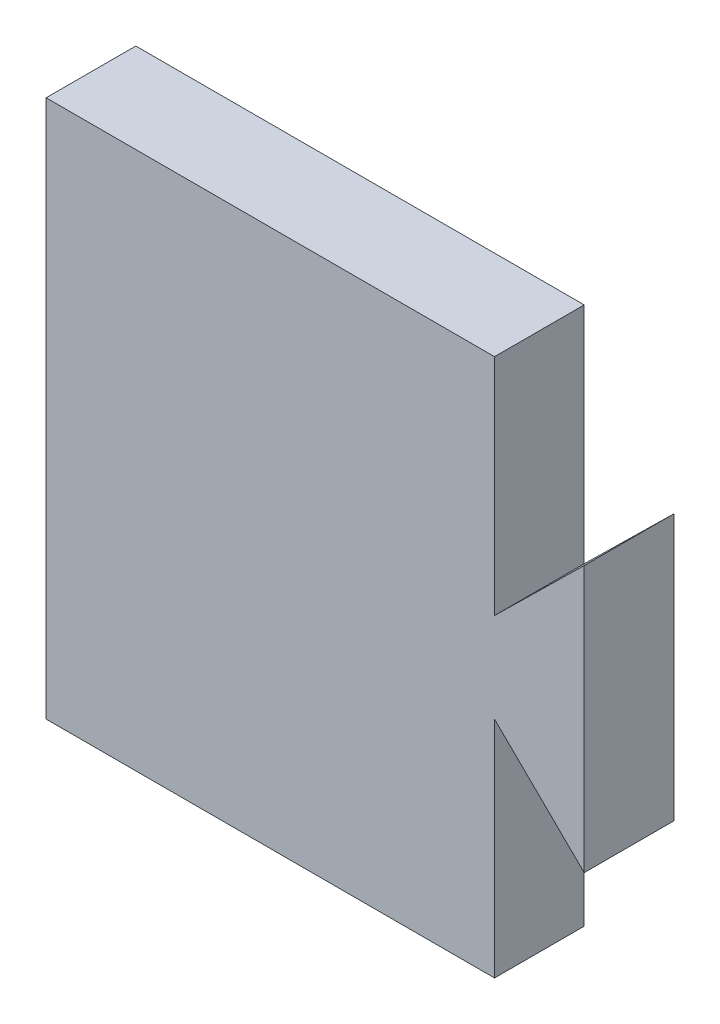
ISO-10303-21;
HEADER;
FILE_DESCRIPTION(('STEP AP214'),'2;1');
FILE_NAME('part.step','',(''),(''),'','','');
FILE_SCHEMA(('AUTOMOTIVE_DESIGN { 1 0 10303 214 1 1 1 1 }'));
ENDSEC;
DATA;
#1=APPLICATION_CONTEXT('core data for automotive mechanical design processes');
#2=APPLICATION_PROTOCOL_DEFINITION('international standard','automotive_design',2000,#1);
#3=PRODUCT_CONTEXT('',#1,'mechanical');
#4=PRODUCT('Part','Part','',(#3));
#5=PRODUCT_RELATED_PRODUCT_CATEGORY('part','',(#4));
#6=PRODUCT_DEFINITION_FORMATION('','',#4);
#7=PRODUCT_DEFINITION_CONTEXT('part definition',#1,'design');
#8=PRODUCT_DEFINITION('design','',#6,#7);
#9=PRODUCT_DEFINITION_SHAPE('','',#8);
#10=(LENGTH_UNIT() NAMED_UNIT(*) SI_UNIT(.MILLI.,.METRE.));
#11=(NAMED_UNIT(*) PLANE_ANGLE_UNIT() SI_UNIT($,.RADIAN.));
#12=(NAMED_UNIT(*) SI_UNIT($,.STERADIAN.) SOLID_ANGLE_UNIT());
#13=UNCERTAINTY_MEASURE_WITH_UNIT(LENGTH_MEASURE(1.E-05),#10,'distance_accuracy_value','');
#14=(GEOMETRIC_REPRESENTATION_CONTEXT(3) GLOBAL_UNCERTAINTY_ASSIGNED_CONTEXT((#13)) GLOBAL_UNIT_ASSIGNED_CONTEXT((#10,
#11,#12)) REPRESENTATION_CONTEXT('',''));
#15=CARTESIAN_POINT('',(0.,0.,0.));
#16=DIRECTION('',(0.,0.,1.));
#17=DIRECTION('',(1.,0.,0.));
#18=AXIS2_PLACEMENT_3D('',#15,#16,#17);
#19=CARTESIAN_POINT('',(7.21311475409836,15.983606557377,10.));
#20=DIRECTION('',(-1.,0.,0.));
#21=DIRECTION('',(0.,-1.,0.));
#22=AXIS2_PLACEMENT_3D('',#19,#20,#21);
#23=PLANE('',#22);
#24=DIRECTION('',(0.,0.,1.));
#25=VECTOR('',#24,1.);
#26=CARTESIAN_POINT('',(7.21311475409836,-9.01639344262295,0.));
#27=LINE('',#26,#25);
#28=CARTESIAN_POINT('',(7.21311475409836,-9.01639344262295,0.));
#29=VERTEX_POINT('',#28);
#30=CARTESIAN_POINT('',(7.21311475409836,-9.01639344262295,10.));
#31=VERTEX_POINT('',#30);
#32=EDGE_CURVE('E160',#29,#31,#27,.T.);
#33=ORIENTED_EDGE('',*,*,#32,.F.);
#34=DIRECTION('',(0.,1.,0.));
#35=VECTOR('',#34,1.);
#36=CARTESIAN_POINT('',(7.21311475409836,15.983606557377,0.));
#37=LINE('',#36,#35);
#38=CARTESIAN_POINT('',(7.21311475409836,15.983606557377,0.));
#39=VERTEX_POINT('',#38);
#40=EDGE_CURVE('E79',#29,#39,#37,.T.);
#41=ORIENTED_EDGE('',*,*,#40,.T.);
#42=DIRECTION('',(0.,0.,-1.));
#43=VECTOR('',#42,1.);
#44=CARTESIAN_POINT('',(7.21311475409836,15.983606557377,10.));
#45=LINE('',#44,#43);
#46=CARTESIAN_POINT('',(7.21311475409836,15.983606557377,10.));
#47=VERTEX_POINT('',#46);
#48=EDGE_CURVE('E193',#47,#39,#45,.T.);
#49=ORIENTED_EDGE('',*,*,#48,.F.);
#50=DIRECTION('',(0.,1.,0.));
#51=VECTOR('',#50,1.);
#52=CARTESIAN_POINT('',(7.21311475409836,15.983606557377,10.));
#53=LINE('',#52,#51);
#54=EDGE_CURVE('E172',#31,#47,#53,.T.);
#55=ORIENTED_EDGE('',*,*,#54,.F.);
#56=EDGE_LOOP('',(#33,#41,#49,#55));
#57=FACE_BOUND('',#56,.T.);
#58=ADVANCED_FACE('F43',(#57),#23,.F.);
#59=CARTESIAN_POINT('',(-42.7868852459017,15.983606557377,10.));
#60=DIRECTION('',(1.,0.,0.));
#61=DIRECTION('',(0.,1.,0.));
#62=AXIS2_PLACEMENT_3D('',#59,#60,#61);
#63=PLANE('',#62);
#64=DIRECTION('',(0.,-1.,0.));
#65=VECTOR('',#64,1.);
#66=CARTESIAN_POINT('',(-42.7868852459017,15.983606557377,0.));
#67=LINE('',#66,#65);
#68=CARTESIAN_POINT('',(-42.7868852459017,15.983606557377,0.));
#69=VERTEX_POINT('',#68);
#70=CARTESIAN_POINT('',(-42.7868852459016,-44.016393442623,0.));
#71=VERTEX_POINT('',#70);
#72=EDGE_CURVE('E163',#69,#71,#67,.T.);
#73=ORIENTED_EDGE('',*,*,#72,.T.);
#74=DIRECTION('',(0.,0.,-1.));
#75=VECTOR('',#74,1.);
#76=CARTESIAN_POINT('',(-42.7868852459016,-44.016393442623,10.));
#77=LINE('',#76,#75);
#78=CARTESIAN_POINT('',(-42.7868852459016,-44.016393442623,10.));
#79=VERTEX_POINT('',#78);
#80=EDGE_CURVE('E11',#79,#71,#77,.T.);
#81=ORIENTED_EDGE('',*,*,#80,.F.);
#82=DIRECTION('',(0.,-1.,0.));
#83=VECTOR('',#82,1.);
#84=CARTESIAN_POINT('',(-42.7868852459017,15.983606557377,10.));
#85=LINE('',#84,#83);
#86=CARTESIAN_POINT('',(-42.7868852459017,15.983606557377,10.));
#87=VERTEX_POINT('',#86);
#88=EDGE_CURVE('E167',#87,#79,#85,.T.);
#89=ORIENTED_EDGE('',*,*,#88,.F.);
#90=DIRECTION('',(0.,0.,-1.));
#91=VECTOR('',#90,1.);
#92=CARTESIAN_POINT('',(-42.7868852459017,15.983606557377,10.));
#93=LINE('',#92,#91);
#94=EDGE_CURVE('E179',#87,#69,#93,.T.);
#95=ORIENTED_EDGE('',*,*,#94,.T.);
#96=EDGE_LOOP('',(#73,#81,#89,#95));
#97=FACE_BOUND('',#96,.T.);
#98=ADVANCED_FACE('F45',(#97),#63,.F.);
#99=CARTESIAN_POINT('',(-42.7868852459016,-44.016393442623,10.));
#100=DIRECTION('',(0.,1.,0.));
#101=DIRECTION('',(0.,0.,1.));
#102=AXIS2_PLACEMENT_3D('',#99,#100,#101);
#103=PLANE('',#102);
#104=DIRECTION('',(1.,0.,0.));
#105=VECTOR('',#104,1.);
#106=CARTESIAN_POINT('',(-42.7868852459016,-44.016393442623,0.));
#107=LINE('',#106,#105);
#108=CARTESIAN_POINT('',(7.21311475409836,-44.016393442623,0.));
#109=VERTEX_POINT('',#108);
#110=EDGE_CURVE('E183',#71,#109,#107,.T.);
#111=ORIENTED_EDGE('',*,*,#110,.T.);
#112=DIRECTION('',(0.,0.,-1.));
#113=VECTOR('',#112,1.);
#114=CARTESIAN_POINT('',(7.21311475409836,-44.016393442623,10.));
#115=LINE('',#114,#113);
#116=CARTESIAN_POINT('',(7.21311475409836,-44.016393442623,10.));
#117=VERTEX_POINT('',#116);
#118=EDGE_CURVE('E53',#117,#109,#115,.T.);
#119=ORIENTED_EDGE('',*,*,#118,.F.);
#120=DIRECTION('',(1.,0.,0.));
#121=VECTOR('',#120,1.);
#122=CARTESIAN_POINT('',(-42.7868852459016,-44.016393442623,10.));
#123=LINE('',#122,#121);
#124=EDGE_CURVE('E92',#79,#117,#123,.T.);
#125=ORIENTED_EDGE('',*,*,#124,.F.);
#126=ORIENTED_EDGE('',*,*,#80,.T.);
#127=EDGE_LOOP('',(#111,#119,#125,#126));
#128=FACE_BOUND('',#127,.T.);
#129=ADVANCED_FACE('F207',(#128),#103,.F.);
#130=CARTESIAN_POINT('',(7.21311475409836,-19.016393442623,0.));
#131=VERTEX_POINT('',#130);
#132=EDGE_CURVE('E186',#109,#131,#37,.T.);
#133=ORIENTED_EDGE('',*,*,#132,.T.);
#134=DIRECTION('',(0.,0.,1.));
#135=VECTOR('',#134,1.);
#136=CARTESIAN_POINT('',(7.21311475409836,-19.016393442623,0.));
#137=LINE('',#136,#135);
#138=CARTESIAN_POINT('',(7.21311475409836,-19.016393442623,10.));
#139=VERTEX_POINT('',#138);
#140=EDGE_CURVE('E131',#131,#139,#137,.T.);
#141=ORIENTED_EDGE('',*,*,#140,.T.);
#142=EDGE_CURVE('E173',#117,#139,#53,.T.);
#143=ORIENTED_EDGE('',*,*,#142,.F.);
#144=ORIENTED_EDGE('',*,*,#118,.T.);
#145=EDGE_LOOP('',(#133,#141,#143,#144));
#146=FACE_BOUND('',#145,.T.);
#147=ADVANCED_FACE('F200',(#146),#23,.F.);
#148=CARTESIAN_POINT('',(-42.7868852459017,15.983606557377,10.));
#149=DIRECTION('',(0.,-1.,0.));
#150=DIRECTION('',(0.,0.,-1.));
#151=AXIS2_PLACEMENT_3D('',#148,#149,#150);
#152=PLANE('',#151);
#153=DIRECTION('',(-1.,0.,0.));
#154=VECTOR('',#153,1.);
#155=CARTESIAN_POINT('',(-42.7868852459017,15.983606557377,0.));
#156=LINE('',#155,#154);
#157=EDGE_CURVE('E85',#39,#69,#156,.T.);
#158=ORIENTED_EDGE('',*,*,#157,.T.);
#159=ORIENTED_EDGE('',*,*,#94,.F.);
#160=DIRECTION('',(-1.,0.,0.));
#161=VECTOR('',#160,1.);
#162=CARTESIAN_POINT('',(-42.7868852459017,15.983606557377,10.));
#163=LINE('',#162,#161);
#164=EDGE_CURVE('E61',#47,#87,#163,.T.);
#165=ORIENTED_EDGE('',*,*,#164,.F.);
#166=ORIENTED_EDGE('',*,*,#48,.T.);
#167=EDGE_LOOP('',(#158,#159,#165,#166));
#168=FACE_BOUND('',#167,.T.);
#169=ADVANCED_FACE('F212',(#168),#152,.F.);
#170=CARTESIAN_POINT('',(0.,0.,10.));
#171=DIRECTION('',(0.,0.,1.));
#172=DIRECTION('',(1.,0.,0.));
#173=AXIS2_PLACEMENT_3D('',#170,#171,#172);
#174=PLANE('',#173);
#175=ORIENTED_EDGE('',*,*,#88,.T.);
#176=ORIENTED_EDGE('',*,*,#124,.T.);
#177=ORIENTED_EDGE('',*,*,#142,.T.);
#178=DIRECTION('',(0.713250449154185,-0.700909264299847,0.));
#179=VECTOR('',#178,1.);
#180=CARTESIAN_POINT('',(17.2131147540984,-28.8433660737798,10.));
#181=LINE('',#180,#179);
#182=CARTESIAN_POINT('',(17.2131147540984,-28.8433660737798,10.));
#183=VERTEX_POINT('',#182);
#184=EDGE_CURVE('E147',#139,#183,#181,.T.);
#185=ORIENTED_EDGE('',*,*,#184,.T.);
#186=DIRECTION('',(0.,1.,0.));
#187=VECTOR('',#186,1.);
#188=CARTESIAN_POINT('',(17.2131147540984,-9.01639344262295,10.));
#189=LINE('',#188,#187);
#190=CARTESIAN_POINT('',(17.2131147540984,0.810579188533854,10.));
#191=VERTEX_POINT('',#190);
#192=EDGE_CURVE('E132',#183,#191,#189,.T.);
#193=ORIENTED_EDGE('',*,*,#192,.T.);
#194=DIRECTION('',(-0.713250449154185,-0.700909264299847,0.));
#195=VECTOR('',#194,1.);
#196=CARTESIAN_POINT('',(7.21311475409836,-9.01639344262295,10.));
#197=LINE('',#196,#195);
#198=EDGE_CURVE('E138',#191,#31,#197,.T.);
#199=ORIENTED_EDGE('',*,*,#198,.T.);
#200=ORIENTED_EDGE('',*,*,#54,.T.);
#201=ORIENTED_EDGE('',*,*,#164,.T.);
#202=EDGE_LOOP('',(#175,#176,#177,#185,#193,#199,#200,#201));
#203=FACE_BOUND('',#202,.T.);
#204=ADVANCED_FACE('F203',(#203),#174,.T.);
#205=CARTESIAN_POINT('',(0.,0.,0.));
#206=DIRECTION('',(0.,0.,1.));
#207=DIRECTION('',(1.,0.,0.));
#208=AXIS2_PLACEMENT_3D('',#205,#206,#207);
#209=PLANE('',#208);
#210=ORIENTED_EDGE('',*,*,#72,.F.);
#211=ORIENTED_EDGE('',*,*,#157,.F.);
#212=ORIENTED_EDGE('',*,*,#40,.F.);
#213=DIRECTION('',(-0.713250449154185,-0.700909264299847,0.));
#214=VECTOR('',#213,1.);
#215=CARTESIAN_POINT('',(7.21311475409836,-9.01639344262295,0.));
#216=LINE('',#215,#214);
#217=CARTESIAN_POINT('',(17.2131147540984,0.810579188533854,0.));
#218=VERTEX_POINT('',#217);
#219=EDGE_CURVE('E136',#218,#29,#216,.T.);
#220=ORIENTED_EDGE('',*,*,#219,.F.);
#221=DIRECTION('',(0.,1.,0.));
#222=VECTOR('',#221,1.);
#223=CARTESIAN_POINT('',(17.2131147540984,-9.01639344262295,0.));
#224=LINE('',#223,#222);
#225=CARTESIAN_POINT('',(17.2131147540984,-28.8433660737798,0.));
#226=VERTEX_POINT('',#225);
#227=EDGE_CURVE('E119',#226,#218,#224,.T.);
#228=ORIENTED_EDGE('',*,*,#227,.F.);
#229=DIRECTION('',(0.713250449154185,-0.700909264299847,0.));
#230=VECTOR('',#229,1.);
#231=CARTESIAN_POINT('',(17.2131147540984,-28.8433660737798,0.));
#232=LINE('',#231,#230);
#233=EDGE_CURVE('E152',#131,#226,#232,.T.);
#234=ORIENTED_EDGE('',*,*,#233,.F.);
#235=ORIENTED_EDGE('',*,*,#132,.F.);
#236=ORIENTED_EDGE('',*,*,#110,.F.);
#237=EDGE_LOOP('',(#210,#211,#212,#220,#228,#234,#235,#236));
#238=FACE_BOUND('',#237,.T.);
#239=ADVANCED_FACE('F142',(#238),#209,.F.);
#240=CARTESIAN_POINT('',(17.2131147540984,-9.01639344262295,0.));
#241=DIRECTION('',(1.,0.,0.));
#242=DIRECTION('',(0.,0.,-1.));
#243=AXIS2_PLACEMENT_3D('',#240,#241,#242);
#244=PLANE('',#243);
#245=ORIENTED_EDGE('',*,*,#192,.F.);
#246=DIRECTION('',(0.,0.,1.));
#247=VECTOR('',#246,1.);
#248=CARTESIAN_POINT('',(17.2131147540984,-28.8433660737798,0.));
#249=LINE('',#248,#247);
#250=EDGE_CURVE('E125',#226,#183,#249,.T.);
#251=ORIENTED_EDGE('',*,*,#250,.F.);
#252=ORIENTED_EDGE('',*,*,#227,.T.);
#253=DIRECTION('',(0.,0.,1.));
#254=VECTOR('',#253,1.);
#255=CARTESIAN_POINT('',(17.2131147540984,0.810579188533854,0.));
#256=LINE('',#255,#254);
#257=EDGE_CURVE('E122',#218,#191,#256,.T.);
#258=ORIENTED_EDGE('',*,*,#257,.T.);
#259=EDGE_LOOP('',(#245,#251,#252,#258));
#260=FACE_BOUND('',#259,.T.);
#261=ADVANCED_FACE('F121',(#260),#244,.T.);
#262=CARTESIAN_POINT('',(17.2131147540984,-28.8433660737798,0.));
#263=DIRECTION('',(-0.700909264299847,-0.713250449154185,0.));
#264=DIRECTION('',(0.713250449154185,-0.700909264299847,0.));
#265=AXIS2_PLACEMENT_3D('',#262,#263,#264);
#266=PLANE('',#265);
#267=ORIENTED_EDGE('',*,*,#184,.F.);
#268=ORIENTED_EDGE('',*,*,#140,.F.);
#269=ORIENTED_EDGE('',*,*,#233,.T.);
#270=ORIENTED_EDGE('',*,*,#250,.T.);
#271=EDGE_LOOP('',(#267,#268,#269,#270));
#272=FACE_BOUND('',#271,.T.);
#273=ADVANCED_FACE('F202',(#272),#266,.T.);
#274=CARTESIAN_POINT('',(7.21311475409836,-9.01639344262295,0.));
#275=DIRECTION('',(-0.700909264299847,0.713250449154185,0.));
#276=DIRECTION('',(-0.713250449154185,-0.700909264299847,0.));
#277=AXIS2_PLACEMENT_3D('',#274,#275,#276);
#278=PLANE('',#277);
#279=ORIENTED_EDGE('',*,*,#198,.F.);
#280=ORIENTED_EDGE('',*,*,#257,.F.);
#281=ORIENTED_EDGE('',*,*,#219,.T.);
#282=ORIENTED_EDGE('',*,*,#32,.T.);
#283=EDGE_LOOP('',(#279,#280,#281,#282));
#284=FACE_BOUND('',#283,.T.);
#285=ADVANCED_FACE('F135',(#284),#278,.T.);
#286=CLOSED_SHELL('',(#58,#98,#129,#147,#169,#204,#239,#261,#273,#285));
#287=MANIFOLD_SOLID_BREP('B2',#286);
#288=ADVANCED_BREP_SHAPE_REPRESENTATION('',(#18,#287),#14);
#289=SHAPE_DEFINITION_REPRESENTATION(#9,#288);
ENDSEC;
END-ISO-10303-21;
